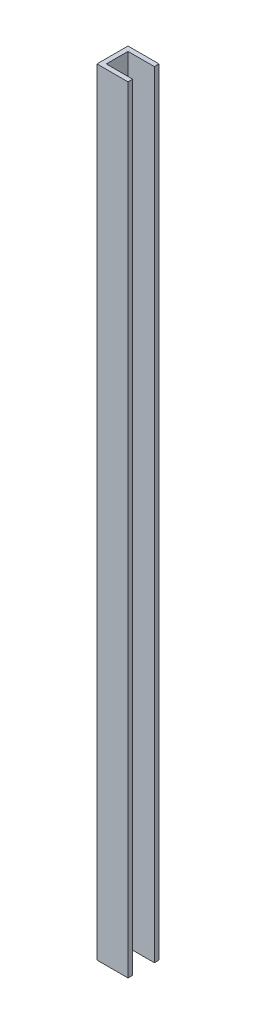
ISO-10303-21;
HEADER;
FILE_DESCRIPTION(('STEP AP214'),'2;1');
FILE_NAME('part.step','',(''),(''),'','','');
FILE_SCHEMA(('AUTOMOTIVE_DESIGN { 1 0 10303 214 1 1 1 1 }'));
ENDSEC;
DATA;
#1=APPLICATION_CONTEXT('core data for automotive mechanical design processes');
#2=APPLICATION_PROTOCOL_DEFINITION('international standard','automotive_design',2000,#1);
#3=PRODUCT_CONTEXT('',#1,'mechanical');
#4=PRODUCT('Part','Part','',(#3));
#5=PRODUCT_RELATED_PRODUCT_CATEGORY('part','',(#4));
#6=PRODUCT_DEFINITION_FORMATION('','',#4);
#7=PRODUCT_DEFINITION_CONTEXT('part definition',#1,'design');
#8=PRODUCT_DEFINITION('design','',#6,#7);
#9=PRODUCT_DEFINITION_SHAPE('','',#8);
#10=(LENGTH_UNIT() NAMED_UNIT(*) SI_UNIT(.MILLI.,.METRE.));
#11=(NAMED_UNIT(*) PLANE_ANGLE_UNIT() SI_UNIT($,.RADIAN.));
#12=(NAMED_UNIT(*) SI_UNIT($,.STERADIAN.) SOLID_ANGLE_UNIT());
#13=UNCERTAINTY_MEASURE_WITH_UNIT(LENGTH_MEASURE(1.E-05),#10,'distance_accuracy_value','');
#14=(GEOMETRIC_REPRESENTATION_CONTEXT(3) GLOBAL_UNCERTAINTY_ASSIGNED_CONTEXT((#13)) GLOBAL_UNIT_ASSIGNED_CONTEXT((#10,
#11,#12)) REPRESENTATION_CONTEXT('',''));
#15=CARTESIAN_POINT('',(0.,0.,0.));
#16=DIRECTION('',(0.,0.,1.));
#17=DIRECTION('',(1.,0.,0.));
#18=AXIS2_PLACEMENT_3D('',#15,#16,#17);
#19=CARTESIAN_POINT('',(-3.5,125.,0.));
#20=DIRECTION('',(1.,0.,0.));
#21=DIRECTION('',(0.,0.,-1.));
#22=AXIS2_PLACEMENT_3D('',#19,#20,#21);
#23=PLANE('',#22);
#24=DIRECTION('',(0.,0.,1.));
#25=VECTOR('',#24,1.);
#26=CARTESIAN_POINT('',(-3.5,-125.,0.));
#27=LINE('',#26,#25);
#28=CARTESIAN_POINT('',(-3.5,-125.,-3.50000000000002));
#29=VERTEX_POINT('',#28);
#30=CARTESIAN_POINT('',(-3.5,-125.,3.50000000000001));
#31=VERTEX_POINT('',#30);
#32=EDGE_CURVE('E197',#29,#31,#27,.T.);
#33=ORIENTED_EDGE('',*,*,#32,.F.);
#34=DIRECTION('',(0.,-1.,0.));
#35=VECTOR('',#34,1.);
#36=CARTESIAN_POINT('',(-3.5,125.,-3.50000000000002));
#37=LINE('',#36,#35);
#38=CARTESIAN_POINT('',(-3.5,125.,-3.50000000000002));
#39=VERTEX_POINT('',#38);
#40=EDGE_CURVE('E11',#39,#29,#37,.T.);
#41=ORIENTED_EDGE('',*,*,#40,.F.);
#42=DIRECTION('',(0.,0.,1.));
#43=VECTOR('',#42,1.);
#44=CARTESIAN_POINT('',(-3.5,125.,0.));
#45=LINE('',#44,#43);
#46=CARTESIAN_POINT('',(-3.5,125.,3.50000000000001));
#47=VERTEX_POINT('',#46);
#48=EDGE_CURVE('E153',#39,#47,#45,.T.);
#49=ORIENTED_EDGE('',*,*,#48,.T.);
#50=DIRECTION('',(0.,-1.,0.));
#51=VECTOR('',#50,1.);
#52=CARTESIAN_POINT('',(-3.5,125.,3.50000000000001));
#53=LINE('',#52,#51);
#54=EDGE_CURVE('E97',#47,#31,#53,.T.);
#55=ORIENTED_EDGE('',*,*,#54,.T.);
#56=EDGE_LOOP('',(#33,#41,#49,#55));
#57=FACE_BOUND('',#56,.T.);
#58=ADVANCED_FACE('F45',(#57),#23,.T.);
#59=CARTESIAN_POINT('',(0.,125.,-3.50000000000002));
#60=DIRECTION('',(0.,0.,1.));
#61=DIRECTION('',(1.,0.,0.));
#62=AXIS2_PLACEMENT_3D('',#59,#60,#61);
#63=PLANE('',#62);
#64=DIRECTION('',(-1.,0.,0.));
#65=VECTOR('',#64,1.);
#66=CARTESIAN_POINT('',(0.,-125.,-3.50000000000002));
#67=LINE('',#66,#65);
#68=CARTESIAN_POINT('',(5.,-125.,-3.50000000000002));
#69=VERTEX_POINT('',#68);
#70=EDGE_CURVE('E190',#69,#29,#67,.T.);
#71=ORIENTED_EDGE('',*,*,#70,.F.);
#72=DIRECTION('',(0.,-1.,0.));
#73=VECTOR('',#72,1.);
#74=CARTESIAN_POINT('',(5.,125.,-3.50000000000002));
#75=LINE('',#74,#73);
#76=CARTESIAN_POINT('',(5.,125.,-3.50000000000002));
#77=VERTEX_POINT('',#76);
#78=EDGE_CURVE('E54',#77,#69,#75,.T.);
#79=ORIENTED_EDGE('',*,*,#78,.F.);
#80=DIRECTION('',(-1.,0.,0.));
#81=VECTOR('',#80,1.);
#82=CARTESIAN_POINT('',(0.,125.,-3.50000000000002));
#83=LINE('',#82,#81);
#84=EDGE_CURVE('E145',#77,#39,#83,.T.);
#85=ORIENTED_EDGE('',*,*,#84,.T.);
#86=ORIENTED_EDGE('',*,*,#40,.T.);
#87=EDGE_LOOP('',(#71,#79,#85,#86));
#88=FACE_BOUND('',#87,.T.);
#89=ADVANCED_FACE('F195',(#88),#63,.T.);
#90=CARTESIAN_POINT('',(5.,125.,0.));
#91=DIRECTION('',(-1.,0.,0.));
#92=DIRECTION('',(0.,0.,1.));
#93=AXIS2_PLACEMENT_3D('',#90,#91,#92);
#94=PLANE('',#93);
#95=DIRECTION('',(0.,0.,-1.));
#96=VECTOR('',#95,1.);
#97=CARTESIAN_POINT('',(5.,-125.,0.));
#98=LINE('',#97,#96);
#99=CARTESIAN_POINT('',(5.,-125.,-5.00000000000002));
#100=VERTEX_POINT('',#99);
#101=EDGE_CURVE('E165',#69,#100,#98,.T.);
#102=ORIENTED_EDGE('',*,*,#101,.T.);
#103=DIRECTION('',(0.,-1.,0.));
#104=VECTOR('',#103,1.);
#105=CARTESIAN_POINT('',(5.,125.,-5.00000000000002));
#106=LINE('',#105,#104);
#107=CARTESIAN_POINT('',(5.,125.,-5.00000000000002));
#108=VERTEX_POINT('',#107);
#109=EDGE_CURVE('E178',#108,#100,#106,.T.);
#110=ORIENTED_EDGE('',*,*,#109,.F.);
#111=DIRECTION('',(0.,0.,-1.));
#112=VECTOR('',#111,1.);
#113=CARTESIAN_POINT('',(5.,125.,0.));
#114=LINE('',#113,#112);
#115=EDGE_CURVE('E138',#77,#108,#114,.T.);
#116=ORIENTED_EDGE('',*,*,#115,.F.);
#117=ORIENTED_EDGE('',*,*,#78,.T.);
#118=EDGE_LOOP('',(#102,#110,#116,#117));
#119=FACE_BOUND('',#118,.T.);
#120=ADVANCED_FACE('F184',(#119),#94,.F.);
#121=CARTESIAN_POINT('',(0.,125.,-5.00000000000002));
#122=DIRECTION('',(0.,0.,-1.));
#123=DIRECTION('',(-1.,0.,0.));
#124=AXIS2_PLACEMENT_3D('',#121,#122,#123);
#125=PLANE('',#124);
#126=DIRECTION('',(1.,0.,0.));
#127=VECTOR('',#126,1.);
#128=CARTESIAN_POINT('',(0.,-125.,-5.00000000000002));
#129=LINE('',#128,#127);
#130=CARTESIAN_POINT('',(-5.,-125.,-5.00000000000002));
#131=VERTEX_POINT('',#130);
#132=EDGE_CURVE('E193',#131,#100,#129,.T.);
#133=ORIENTED_EDGE('',*,*,#132,.F.);
#134=DIRECTION('',(0.,-1.,0.));
#135=VECTOR('',#134,1.);
#136=CARTESIAN_POINT('',(-5.,125.,-5.00000000000002));
#137=LINE('',#136,#135);
#138=CARTESIAN_POINT('',(-5.,125.,-5.00000000000002));
#139=VERTEX_POINT('',#138);
#140=EDGE_CURVE('E175',#139,#131,#137,.T.);
#141=ORIENTED_EDGE('',*,*,#140,.F.);
#142=DIRECTION('',(1.,0.,0.));
#143=VECTOR('',#142,1.);
#144=CARTESIAN_POINT('',(0.,125.,-5.00000000000002));
#145=LINE('',#144,#143);
#146=EDGE_CURVE('E144',#139,#108,#145,.T.);
#147=ORIENTED_EDGE('',*,*,#146,.T.);
#148=ORIENTED_EDGE('',*,*,#109,.T.);
#149=EDGE_LOOP('',(#133,#141,#147,#148));
#150=FACE_BOUND('',#149,.T.);
#151=ADVANCED_FACE('F210',(#150),#125,.T.);
#152=CARTESIAN_POINT('',(-5.,125.,0.));
#153=DIRECTION('',(-1.,0.,0.));
#154=DIRECTION('',(0.,0.,1.));
#155=AXIS2_PLACEMENT_3D('',#152,#153,#154);
#156=PLANE('',#155);
#157=DIRECTION('',(0.,0.,-1.));
#158=VECTOR('',#157,1.);
#159=CARTESIAN_POINT('',(-5.,-125.,0.));
#160=LINE('',#159,#158);
#161=CARTESIAN_POINT('',(-5.,-125.,5.00000000000002));
#162=VERTEX_POINT('',#161);
#163=EDGE_CURVE('E203',#162,#131,#160,.T.);
#164=ORIENTED_EDGE('',*,*,#163,.F.);
#165=DIRECTION('',(0.,-1.,0.));
#166=VECTOR('',#165,1.);
#167=CARTESIAN_POINT('',(-5.,125.,5.00000000000002));
#168=LINE('',#167,#166);
#169=CARTESIAN_POINT('',(-5.,125.,5.00000000000002));
#170=VERTEX_POINT('',#169);
#171=EDGE_CURVE('E132',#170,#162,#168,.T.);
#172=ORIENTED_EDGE('',*,*,#171,.F.);
#173=DIRECTION('',(0.,0.,-1.));
#174=VECTOR('',#173,1.);
#175=CARTESIAN_POINT('',(-5.,125.,0.));
#176=LINE('',#175,#174);
#177=EDGE_CURVE('E123',#170,#139,#176,.T.);
#178=ORIENTED_EDGE('',*,*,#177,.T.);
#179=ORIENTED_EDGE('',*,*,#140,.T.);
#180=EDGE_LOOP('',(#164,#172,#178,#179));
#181=FACE_BOUND('',#180,.T.);
#182=ADVANCED_FACE('F208',(#181),#156,.T.);
#183=CARTESIAN_POINT('',(0.,125.,5.00000000000002));
#184=DIRECTION('',(0.,0.,-1.));
#185=DIRECTION('',(-1.,0.,0.));
#186=AXIS2_PLACEMENT_3D('',#183,#184,#185);
#187=PLANE('',#186);
#188=DIRECTION('',(1.,0.,0.));
#189=VECTOR('',#188,1.);
#190=CARTESIAN_POINT('',(0.,-125.,5.00000000000002));
#191=LINE('',#190,#189);
#192=CARTESIAN_POINT('',(5.,-125.,5.00000000000002));
#193=VERTEX_POINT('',#192);
#194=EDGE_CURVE('E130',#162,#193,#191,.T.);
#195=ORIENTED_EDGE('',*,*,#194,.T.);
#196=DIRECTION('',(0.,-1.,0.));
#197=VECTOR('',#196,1.);
#198=CARTESIAN_POINT('',(5.,125.,5.00000000000002));
#199=LINE('',#198,#197);
#200=CARTESIAN_POINT('',(5.,125.,5.00000000000002));
#201=VERTEX_POINT('',#200);
#202=EDGE_CURVE('E127',#201,#193,#199,.T.);
#203=ORIENTED_EDGE('',*,*,#202,.F.);
#204=DIRECTION('',(1.,0.,0.));
#205=VECTOR('',#204,1.);
#206=CARTESIAN_POINT('',(0.,125.,5.00000000000002));
#207=LINE('',#206,#205);
#208=EDGE_CURVE('E116',#170,#201,#207,.T.);
#209=ORIENTED_EDGE('',*,*,#208,.F.);
#210=ORIENTED_EDGE('',*,*,#171,.T.);
#211=EDGE_LOOP('',(#195,#203,#209,#210));
#212=FACE_BOUND('',#211,.T.);
#213=ADVANCED_FACE('F128',(#212),#187,.F.);
#214=CARTESIAN_POINT('',(5.,-125.,3.50000000000001));
#215=VERTEX_POINT('',#214);
#216=EDGE_CURVE('E90',#193,#215,#98,.T.);
#217=ORIENTED_EDGE('',*,*,#216,.T.);
#218=DIRECTION('',(0.,-1.,0.));
#219=VECTOR('',#218,1.);
#220=CARTESIAN_POINT('',(5.,125.,3.50000000000001));
#221=LINE('',#220,#219);
#222=CARTESIAN_POINT('',(5.,125.,3.50000000000001));
#223=VERTEX_POINT('',#222);
#224=EDGE_CURVE('E133',#223,#215,#221,.T.);
#225=ORIENTED_EDGE('',*,*,#224,.F.);
#226=EDGE_CURVE('E120',#201,#223,#114,.T.);
#227=ORIENTED_EDGE('',*,*,#226,.F.);
#228=ORIENTED_EDGE('',*,*,#202,.T.);
#229=EDGE_LOOP('',(#217,#225,#227,#228));
#230=FACE_BOUND('',#229,.T.);
#231=ADVANCED_FACE('F135',(#230),#94,.F.);
#232=CARTESIAN_POINT('',(0.,125.,3.50000000000001));
#233=DIRECTION('',(0.,0.,1.));
#234=DIRECTION('',(1.,0.,0.));
#235=AXIS2_PLACEMENT_3D('',#232,#233,#234);
#236=PLANE('',#235);
#237=DIRECTION('',(-1.,0.,0.));
#238=VECTOR('',#237,1.);
#239=CARTESIAN_POINT('',(0.,-125.,3.50000000000001));
#240=LINE('',#239,#238);
#241=EDGE_CURVE('E156',#215,#31,#240,.T.);
#242=ORIENTED_EDGE('',*,*,#241,.T.);
#243=ORIENTED_EDGE('',*,*,#54,.F.);
#244=DIRECTION('',(-1.,0.,0.));
#245=VECTOR('',#244,1.);
#246=CARTESIAN_POINT('',(0.,125.,3.50000000000001));
#247=LINE('',#246,#245);
#248=EDGE_CURVE('E62',#223,#47,#247,.T.);
#249=ORIENTED_EDGE('',*,*,#248,.F.);
#250=ORIENTED_EDGE('',*,*,#224,.T.);
#251=EDGE_LOOP('',(#242,#243,#249,#250));
#252=FACE_BOUND('',#251,.T.);
#253=ADVANCED_FACE('F260',(#252),#236,.F.);
#254=CARTESIAN_POINT('',(0.,125.,0.));
#255=DIRECTION('',(0.,1.,0.));
#256=DIRECTION('',(0.,0.,1.));
#257=AXIS2_PLACEMENT_3D('',#254,#255,#256);
#258=PLANE('',#257);
#259=ORIENTED_EDGE('',*,*,#48,.F.);
#260=ORIENTED_EDGE('',*,*,#84,.F.);
#261=ORIENTED_EDGE('',*,*,#115,.T.);
#262=ORIENTED_EDGE('',*,*,#146,.F.);
#263=ORIENTED_EDGE('',*,*,#177,.F.);
#264=ORIENTED_EDGE('',*,*,#208,.T.);
#265=ORIENTED_EDGE('',*,*,#226,.T.);
#266=ORIENTED_EDGE('',*,*,#248,.T.);
#267=EDGE_LOOP('',(#259,#260,#261,#262,#263,#264,#265,#266));
#268=FACE_BOUND('',#267,.T.);
#269=ADVANCED_FACE('F118',(#268),#258,.T.);
#270=CARTESIAN_POINT('',(0.,-125.,0.));
#271=DIRECTION('',(0.,1.,0.));
#272=DIRECTION('',(0.,0.,1.));
#273=AXIS2_PLACEMENT_3D('',#270,#271,#272);
#274=PLANE('',#273);
#275=ORIENTED_EDGE('',*,*,#32,.T.);
#276=ORIENTED_EDGE('',*,*,#241,.F.);
#277=ORIENTED_EDGE('',*,*,#216,.F.);
#278=ORIENTED_EDGE('',*,*,#194,.F.);
#279=ORIENTED_EDGE('',*,*,#163,.T.);
#280=ORIENTED_EDGE('',*,*,#132,.T.);
#281=ORIENTED_EDGE('',*,*,#101,.F.);
#282=ORIENTED_EDGE('',*,*,#70,.T.);
#283=EDGE_LOOP('',(#275,#276,#277,#278,#279,#280,#281,#282));
#284=FACE_BOUND('',#283,.T.);
#285=ADVANCED_FACE('F189',(#284),#274,.F.);
#286=CLOSED_SHELL('',(#58,#89,#120,#151,#182,#213,#231,#253,#269,#285));
#287=MANIFOLD_SOLID_BREP('B2',#286);
#288=ADVANCED_BREP_SHAPE_REPRESENTATION('',(#18,#287),#14);
#289=SHAPE_DEFINITION_REPRESENTATION(#9,#288);
ENDSEC;
END-ISO-10303-21;
